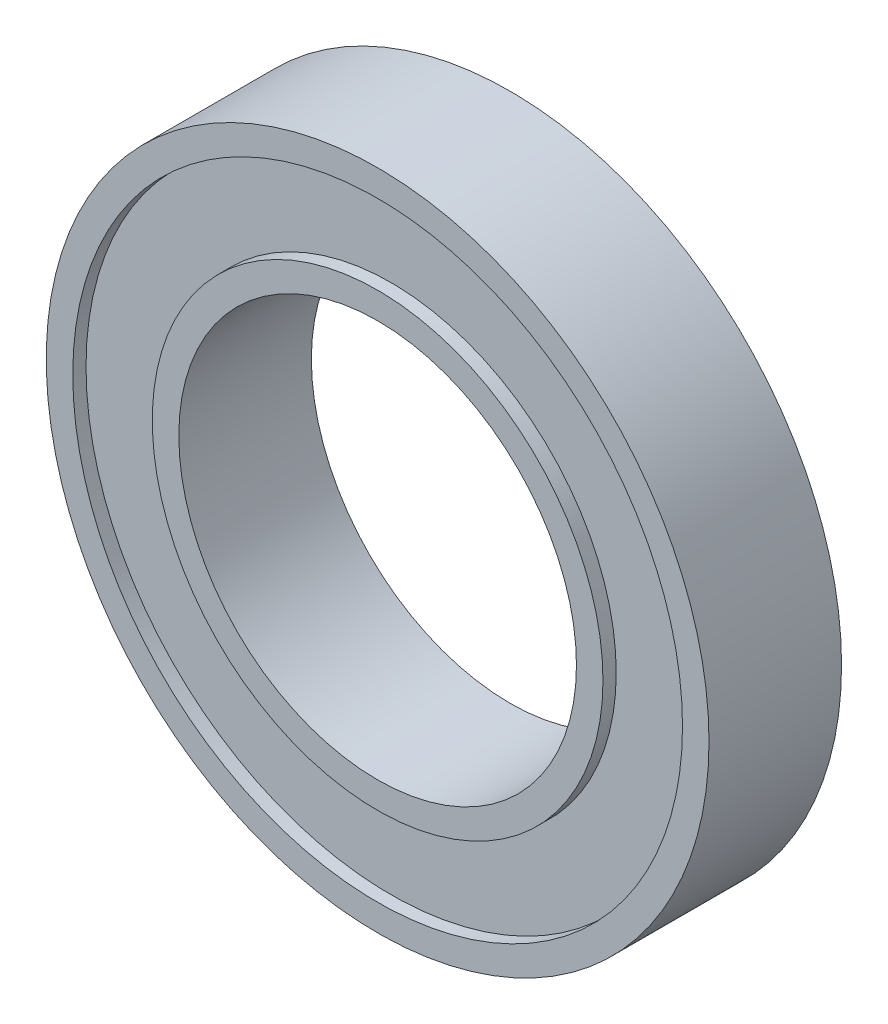
ISO-10303-21;
HEADER;
FILE_DESCRIPTION(('STEP AP214'),'2;1');
FILE_NAME('part.step','',(''),(''),'','','');
FILE_SCHEMA(('AUTOMOTIVE_DESIGN { 1 0 10303 214 1 1 1 1 }'));
ENDSEC;
DATA;
#1=APPLICATION_CONTEXT('core data for automotive mechanical design processes');
#2=APPLICATION_PROTOCOL_DEFINITION('international standard','automotive_design',2000,#1);
#3=PRODUCT_CONTEXT('',#1,'mechanical');
#4=PRODUCT('Part','Part','',(#3));
#5=PRODUCT_RELATED_PRODUCT_CATEGORY('part','',(#4));
#6=PRODUCT_DEFINITION_FORMATION('','',#4);
#7=PRODUCT_DEFINITION_CONTEXT('part definition',#1,'design');
#8=PRODUCT_DEFINITION('design','',#6,#7);
#9=PRODUCT_DEFINITION_SHAPE('','',#8);
#10=(LENGTH_UNIT() NAMED_UNIT(*) SI_UNIT(.MILLI.,.METRE.));
#11=(NAMED_UNIT(*) PLANE_ANGLE_UNIT() SI_UNIT($,.RADIAN.));
#12=(NAMED_UNIT(*) SI_UNIT($,.STERADIAN.) SOLID_ANGLE_UNIT());
#13=UNCERTAINTY_MEASURE_WITH_UNIT(LENGTH_MEASURE(1.E-05),#10,'distance_accuracy_value','');
#14=(GEOMETRIC_REPRESENTATION_CONTEXT(3) GLOBAL_UNCERTAINTY_ASSIGNED_CONTEXT((#13)) GLOBAL_UNIT_ASSIGNED_CONTEXT((#10,
#11,#12)) REPRESENTATION_CONTEXT('',''));
#15=CARTESIAN_POINT('',(0.,0.,0.));
#16=DIRECTION('',(0.,0.,1.));
#17=DIRECTION('',(1.,0.,0.));
#18=AXIS2_PLACEMENT_3D('',#15,#16,#17);
#19=CARTESIAN_POINT('',(0.,0.,-5.));
#20=DIRECTION('',(0.,0.,1.));
#21=DIRECTION('',(1.,0.,0.));
#22=AXIS2_PLACEMENT_3D('',#19,#20,#21);
#23=CYLINDRICAL_SURFACE('',#22,17.);
#24=CARTESIAN_POINT('',(0.,0.,-5.));
#25=DIRECTION('',(0.,0.,1.));
#26=DIRECTION('',(1.,0.,0.));
#27=AXIS2_PLACEMENT_3D('',#24,#25,#26);
#28=CIRCLE('',#27,17.);
#29=CARTESIAN_POINT('',(17.,0.,-5.));
#30=VERTEX_POINT('',#29);
#31=EDGE_CURVE('E49',#30,#30,#28,.T.);
#32=ORIENTED_EDGE('',*,*,#31,.T.);
#33=EDGE_LOOP('',(#32));
#34=FACE_BOUND('',#33,.T.);
#35=CARTESIAN_POINT('',(0.,0.,-4.));
#36=DIRECTION('',(0.,0.,1.));
#37=DIRECTION('',(1.,0.,0.));
#38=AXIS2_PLACEMENT_3D('',#35,#36,#37);
#39=CIRCLE('',#38,17.);
#40=CARTESIAN_POINT('',(17.,0.,-4.));
#41=VERTEX_POINT('',#40);
#42=EDGE_CURVE('E68',#41,#41,#39,.T.);
#43=ORIENTED_EDGE('',*,*,#42,.F.);
#44=EDGE_LOOP('',(#43));
#45=FACE_BOUND('',#44,.T.);
#46=ADVANCED_FACE('F42',(#34,#45),#23,.T.);
#47=CARTESIAN_POINT('',(0.,0.,-5.));
#48=DIRECTION('',(0.,0.,1.));
#49=DIRECTION('',(1.,0.,0.));
#50=AXIS2_PLACEMENT_3D('',#47,#48,#49);
#51=CYLINDRICAL_SURFACE('',#50,15.);
#52=CARTESIAN_POINT('',(0.,0.,-5.));
#53=DIRECTION('',(0.,0.,1.));
#54=DIRECTION('',(1.,0.,0.));
#55=AXIS2_PLACEMENT_3D('',#52,#53,#54);
#56=CIRCLE('',#55,15.);
#57=CARTESIAN_POINT('',(15.,0.,-5.));
#58=VERTEX_POINT('',#57);
#59=EDGE_CURVE('E53',#58,#58,#56,.T.);
#60=ORIENTED_EDGE('',*,*,#59,.F.);
#61=EDGE_LOOP('',(#60));
#62=FACE_BOUND('',#61,.T.);
#63=CARTESIAN_POINT('',(0.,0.,5.));
#64=DIRECTION('',(0.,0.,1.));
#65=DIRECTION('',(1.,0.,0.));
#66=AXIS2_PLACEMENT_3D('',#63,#64,#65);
#67=CIRCLE('',#66,15.);
#68=CARTESIAN_POINT('',(15.,0.,5.));
#69=VERTEX_POINT('',#68);
#70=EDGE_CURVE('E62',#69,#69,#67,.T.);
#71=ORIENTED_EDGE('',*,*,#70,.T.);
#72=EDGE_LOOP('',(#71));
#73=FACE_BOUND('',#72,.T.);
#74=ADVANCED_FACE('F44',(#62,#73),#51,.F.);
#75=CARTESIAN_POINT('',(0.,0.,4.));
#76=DIRECTION('',(0.,0.,1.));
#77=DIRECTION('',(1.,0.,0.));
#78=AXIS2_PLACEMENT_3D('',#75,#76,#77);
#79=CIRCLE('',#78,17.);
#80=CARTESIAN_POINT('',(17.,0.,4.));
#81=VERTEX_POINT('',#80);
#82=EDGE_CURVE('E11',#81,#81,#79,.F.);
#83=ORIENTED_EDGE('',*,*,#82,.F.);
#84=EDGE_LOOP('',(#83));
#85=FACE_BOUND('',#84,.T.);
#86=CARTESIAN_POINT('',(0.,0.,5.));
#87=DIRECTION('',(0.,0.,1.));
#88=DIRECTION('',(1.,0.,0.));
#89=AXIS2_PLACEMENT_3D('',#86,#87,#88);
#90=CIRCLE('',#89,17.);
#91=CARTESIAN_POINT('',(17.,0.,5.));
#92=VERTEX_POINT('',#91);
#93=EDGE_CURVE('E57',#92,#92,#90,.T.);
#94=ORIENTED_EDGE('',*,*,#93,.F.);
#95=EDGE_LOOP('',(#94));
#96=FACE_BOUND('',#95,.T.);
#97=ADVANCED_FACE('F110',(#85,#96),#23,.T.);
#98=CARTESIAN_POINT('',(0.,0.,-5.));
#99=DIRECTION('',(0.,0.,1.));
#100=DIRECTION('',(1.,0.,0.));
#101=AXIS2_PLACEMENT_3D('',#98,#99,#100);
#102=PLANE('',#101);
#103=ORIENTED_EDGE('',*,*,#59,.T.);
#104=EDGE_LOOP('',(#103));
#105=FACE_BOUND('',#104,.T.);
#106=ORIENTED_EDGE('',*,*,#31,.F.);
#107=EDGE_LOOP('',(#106));
#108=FACE_BOUND('',#107,.T.);
#109=ADVANCED_FACE('F118',(#105,#108),#102,.F.);
#110=CARTESIAN_POINT('',(0.,0.,5.));
#111=DIRECTION('',(0.,0.,1.));
#112=DIRECTION('',(1.,0.,0.));
#113=AXIS2_PLACEMENT_3D('',#110,#111,#112);
#114=PLANE('',#113);
#115=ORIENTED_EDGE('',*,*,#70,.F.);
#116=EDGE_LOOP('',(#115));
#117=FACE_BOUND('',#116,.T.);
#118=ORIENTED_EDGE('',*,*,#93,.T.);
#119=EDGE_LOOP('',(#118));
#120=FACE_BOUND('',#119,.T.);
#121=ADVANCED_FACE('F123',(#117,#120),#114,.T.);
#122=CARTESIAN_POINT('',(0.,0.,-4.));
#123=DIRECTION('',(0.,0.,1.));
#124=DIRECTION('',(1.,0.,0.));
#125=AXIS2_PLACEMENT_3D('',#122,#123,#124);
#126=PLANE('',#125);
#127=ORIENTED_EDGE('',*,*,#42,.T.);
#128=EDGE_LOOP('',(#127));
#129=FACE_BOUND('',#128,.T.);
#130=CARTESIAN_POINT('',(0.,0.,-4.));
#131=DIRECTION('',(0.,0.,1.));
#132=DIRECTION('',(1.,0.,0.));
#133=AXIS2_PLACEMENT_3D('',#130,#131,#132);
#134=CIRCLE('',#133,23.);
#135=CARTESIAN_POINT('',(23.,0.,-4.));
#136=VERTEX_POINT('',#135);
#137=EDGE_CURVE('E65',#136,#136,#134,.T.);
#138=ORIENTED_EDGE('',*,*,#137,.F.);
#139=EDGE_LOOP('',(#138));
#140=FACE_BOUND('',#139,.T.);
#141=ADVANCED_FACE('F129',(#129,#140),#126,.F.);
#142=CARTESIAN_POINT('',(0.,0.,4.));
#143=DIRECTION('',(0.,0.,1.));
#144=DIRECTION('',(1.,0.,0.));
#145=AXIS2_PLACEMENT_3D('',#142,#143,#144);
#146=PLANE('',#145);
#147=ORIENTED_EDGE('',*,*,#82,.T.);
#148=EDGE_LOOP('',(#147));
#149=FACE_BOUND('',#148,.T.);
#150=CARTESIAN_POINT('',(0.,0.,4.));
#151=DIRECTION('',(0.,0.,1.));
#152=DIRECTION('',(1.,0.,0.));
#153=AXIS2_PLACEMENT_3D('',#150,#151,#152);
#154=CIRCLE('',#153,23.);
#155=CARTESIAN_POINT('',(23.,0.,4.));
#156=VERTEX_POINT('',#155);
#157=EDGE_CURVE('E71',#156,#156,#154,.T.);
#158=ORIENTED_EDGE('',*,*,#157,.T.);
#159=EDGE_LOOP('',(#158));
#160=FACE_BOUND('',#159,.T.);
#161=ADVANCED_FACE('F135',(#149,#160),#146,.T.);
#162=CARTESIAN_POINT('',(0.,0.,-5.));
#163=DIRECTION('',(0.,0.,1.));
#164=DIRECTION('',(1.,0.,0.));
#165=AXIS2_PLACEMENT_3D('',#162,#163,#164);
#166=CYLINDRICAL_SURFACE('',#165,23.);
#167=CARTESIAN_POINT('',(0.,0.,-5.));
#168=DIRECTION('',(0.,0.,1.));
#169=DIRECTION('',(1.,0.,0.));
#170=AXIS2_PLACEMENT_3D('',#167,#168,#169);
#171=CIRCLE('',#170,23.);
#172=CARTESIAN_POINT('',(23.,0.,-5.));
#173=VERTEX_POINT('',#172);
#174=EDGE_CURVE('E77',#173,#173,#171,.T.);
#175=ORIENTED_EDGE('',*,*,#174,.F.);
#176=EDGE_LOOP('',(#175));
#177=FACE_BOUND('',#176,.T.);
#178=ORIENTED_EDGE('',*,*,#137,.T.);
#179=EDGE_LOOP('',(#178));
#180=FACE_BOUND('',#179,.T.);
#181=ADVANCED_FACE('F106',(#177,#180),#166,.F.);
#182=ORIENTED_EDGE('',*,*,#157,.F.);
#183=EDGE_LOOP('',(#182));
#184=FACE_BOUND('',#183,.T.);
#185=CARTESIAN_POINT('',(0.,0.,5.));
#186=DIRECTION('',(0.,0.,1.));
#187=DIRECTION('',(1.,0.,0.));
#188=AXIS2_PLACEMENT_3D('',#185,#186,#187);
#189=CIRCLE('',#188,23.);
#190=CARTESIAN_POINT('',(23.,0.,5.));
#191=VERTEX_POINT('',#190);
#192=EDGE_CURVE('E83',#191,#191,#189,.T.);
#193=ORIENTED_EDGE('',*,*,#192,.T.);
#194=EDGE_LOOP('',(#193));
#195=FACE_BOUND('',#194,.T.);
#196=ADVANCED_FACE('F87',(#184,#195),#166,.F.);
#197=CARTESIAN_POINT('',(0.,0.,-5.));
#198=DIRECTION('',(0.,0.,1.));
#199=DIRECTION('',(1.,0.,0.));
#200=AXIS2_PLACEMENT_3D('',#197,#198,#199);
#201=CYLINDRICAL_SURFACE('',#200,25.);
#202=CARTESIAN_POINT('',(0.,0.,-5.));
#203=DIRECTION('',(0.,0.,1.));
#204=DIRECTION('',(1.,0.,0.));
#205=AXIS2_PLACEMENT_3D('',#202,#203,#204);
#206=CIRCLE('',#205,25.);
#207=CARTESIAN_POINT('',(25.,0.,-5.));
#208=VERTEX_POINT('',#207);
#209=EDGE_CURVE('E74',#208,#208,#206,.T.);
#210=ORIENTED_EDGE('',*,*,#209,.T.);
#211=EDGE_LOOP('',(#210));
#212=FACE_BOUND('',#211,.T.);
#213=CARTESIAN_POINT('',(0.,0.,5.));
#214=DIRECTION('',(0.,0.,1.));
#215=DIRECTION('',(1.,0.,0.));
#216=AXIS2_PLACEMENT_3D('',#213,#214,#215);
#217=CIRCLE('',#216,25.);
#218=CARTESIAN_POINT('',(25.,0.,5.));
#219=VERTEX_POINT('',#218);
#220=EDGE_CURVE('E80',#219,#219,#217,.T.);
#221=ORIENTED_EDGE('',*,*,#220,.F.);
#222=EDGE_LOOP('',(#221));
#223=FACE_BOUND('',#222,.T.);
#224=ADVANCED_FACE('F96',(#212,#223),#201,.T.);
#225=CARTESIAN_POINT('',(0.,0.,-5.));
#226=DIRECTION('',(0.,0.,1.));
#227=DIRECTION('',(1.,0.,0.));
#228=AXIS2_PLACEMENT_3D('',#225,#226,#227);
#229=PLANE('',#228);
#230=ORIENTED_EDGE('',*,*,#174,.T.);
#231=EDGE_LOOP('',(#230));
#232=FACE_BOUND('',#231,.T.);
#233=ORIENTED_EDGE('',*,*,#209,.F.);
#234=EDGE_LOOP('',(#233));
#235=FACE_BOUND('',#234,.T.);
#236=ADVANCED_FACE('F92',(#232,#235),#229,.F.);
#237=CARTESIAN_POINT('',(0.,0.,5.));
#238=DIRECTION('',(0.,0.,1.));
#239=DIRECTION('',(1.,0.,0.));
#240=AXIS2_PLACEMENT_3D('',#237,#238,#239);
#241=PLANE('',#240);
#242=ORIENTED_EDGE('',*,*,#192,.F.);
#243=EDGE_LOOP('',(#242));
#244=FACE_BOUND('',#243,.T.);
#245=ORIENTED_EDGE('',*,*,#220,.T.);
#246=EDGE_LOOP('',(#245));
#247=FACE_BOUND('',#246,.T.);
#248=ADVANCED_FACE('F89',(#244,#247),#241,.T.);
#249=CLOSED_SHELL('',(#46,#74,#97,#109,#121,#141,#161,#181,#196,#224,#236,#248));
#250=MANIFOLD_SOLID_BREP('B2',#249);
#251=ADVANCED_BREP_SHAPE_REPRESENTATION('',(#18,#250),#14);
#252=SHAPE_DEFINITION_REPRESENTATION(#9,#251);
ENDSEC;
END-ISO-10303-21;
